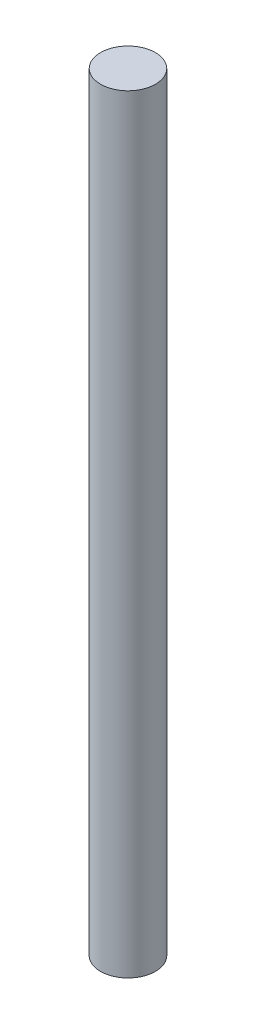
ISO-10303-21;
HEADER;
FILE_DESCRIPTION(('STEP AP214'),'2;1');
FILE_NAME('part.step','',(''),(''),'','','');
FILE_SCHEMA(('AUTOMOTIVE_DESIGN { 1 0 10303 214 1 1 1 1 }'));
ENDSEC;
DATA;
#1=APPLICATION_CONTEXT('core data for automotive mechanical design processes');
#2=APPLICATION_PROTOCOL_DEFINITION('international standard','automotive_design',2000,#1);
#3=PRODUCT_CONTEXT('',#1,'mechanical');
#4=PRODUCT('Part','Part','',(#3));
#5=PRODUCT_RELATED_PRODUCT_CATEGORY('part','',(#4));
#6=PRODUCT_DEFINITION_FORMATION('','',#4);
#7=PRODUCT_DEFINITION_CONTEXT('part definition',#1,'design');
#8=PRODUCT_DEFINITION('design','',#6,#7);
#9=PRODUCT_DEFINITION_SHAPE('','',#8);
#10=(LENGTH_UNIT() NAMED_UNIT(*) SI_UNIT(.MILLI.,.METRE.));
#11=(NAMED_UNIT(*) PLANE_ANGLE_UNIT() SI_UNIT($,.RADIAN.));
#12=(NAMED_UNIT(*) SI_UNIT($,.STERADIAN.) SOLID_ANGLE_UNIT());
#13=UNCERTAINTY_MEASURE_WITH_UNIT(LENGTH_MEASURE(1.E-05),#10,'distance_accuracy_value','');
#14=(GEOMETRIC_REPRESENTATION_CONTEXT(3) GLOBAL_UNCERTAINTY_ASSIGNED_CONTEXT((#13)) GLOBAL_UNIT_ASSIGNED_CONTEXT((#10,
#11,#12)) REPRESENTATION_CONTEXT('',''));
#15=CARTESIAN_POINT('',(0.,0.,0.));
#16=DIRECTION('',(0.,0.,1.));
#17=DIRECTION('',(1.,0.,0.));
#18=AXIS2_PLACEMENT_3D('',#15,#16,#17);
#19=CARTESIAN_POINT('',(0.,70.,0.));
#20=DIRECTION('',(0.,-1.,0.));
#21=DIRECTION('',(0.,0.,-1.));
#22=AXIS2_PLACEMENT_3D('',#19,#20,#21);
#23=CYLINDRICAL_SURFACE('',#22,2.5);
#24=CARTESIAN_POINT('',(0.,70.,0.));
#25=DIRECTION('',(0.,1.,0.));
#26=DIRECTION('',(0.,0.,1.));
#27=AXIS2_PLACEMENT_3D('',#24,#25,#26);
#28=CIRCLE('',#27,2.5);
#29=CARTESIAN_POINT('',(0.,70.,2.5));
#30=VERTEX_POINT('',#29);
#31=EDGE_CURVE('E10',#30,#30,#28,.T.);
#32=ORIENTED_EDGE('',*,*,#31,.F.);
#33=EDGE_LOOP('',(#32));
#34=FACE_BOUND('',#33,.T.);
#35=CARTESIAN_POINT('',(0.,0.,0.));
#36=DIRECTION('',(0.,1.,0.));
#37=DIRECTION('',(0.,0.,1.));
#38=AXIS2_PLACEMENT_3D('',#35,#36,#37);
#39=CIRCLE('',#38,2.5);
#40=CARTESIAN_POINT('',(0.,0.,2.5));
#41=VERTEX_POINT('',#40);
#42=EDGE_CURVE('E42',#41,#41,#39,.T.);
#43=ORIENTED_EDGE('',*,*,#42,.T.);
#44=EDGE_LOOP('',(#43));
#45=FACE_BOUND('',#44,.T.);
#46=ADVANCED_FACE('F39',(#34,#45),#23,.T.);
#47=CARTESIAN_POINT('',(0.,70.,0.));
#48=DIRECTION('',(0.,1.,0.));
#49=DIRECTION('',(0.,0.,1.));
#50=AXIS2_PLACEMENT_3D('',#47,#48,#49);
#51=PLANE('',#50);
#52=ORIENTED_EDGE('',*,*,#31,.T.);
#53=EDGE_LOOP('',(#52));
#54=FACE_BOUND('',#53,.T.);
#55=ADVANCED_FACE('F54',(#54),#51,.T.);
#56=CARTESIAN_POINT('',(0.,0.,0.));
#57=DIRECTION('',(0.,1.,0.));
#58=DIRECTION('',(0.,0.,1.));
#59=AXIS2_PLACEMENT_3D('',#56,#57,#58);
#60=PLANE('',#59);
#61=ORIENTED_EDGE('',*,*,#42,.F.);
#62=EDGE_LOOP('',(#61));
#63=FACE_BOUND('',#62,.T.);
#64=ADVANCED_FACE('F52',(#63),#60,.F.);
#65=CLOSED_SHELL('',(#46,#55,#64));
#66=MANIFOLD_SOLID_BREP('B2',#65);
#67=ADVANCED_BREP_SHAPE_REPRESENTATION('',(#18,#66),#14);
#68=SHAPE_DEFINITION_REPRESENTATION(#9,#67);
ENDSEC;
END-ISO-10303-21;
